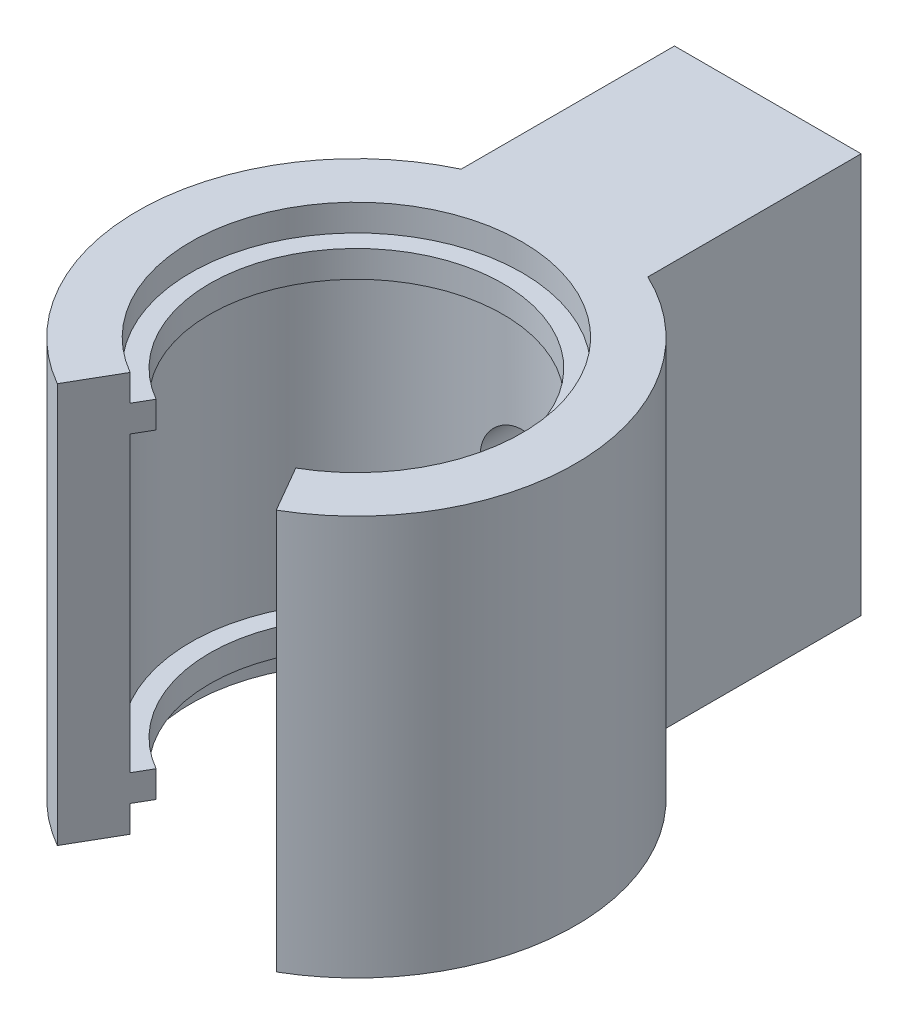
ISO-10303-21;
HEADER;
FILE_DESCRIPTION(('STEP AP214'),'2;1');
FILE_NAME('part.step','',(''),(''),'','','');
FILE_SCHEMA(('AUTOMOTIVE_DESIGN { 1 0 10303 214 1 1 1 1 }'));
ENDSEC;
DATA;
#1=APPLICATION_CONTEXT('core data for automotive mechanical design processes');
#2=APPLICATION_PROTOCOL_DEFINITION('international standard','automotive_design',2000,#1);
#3=PRODUCT_CONTEXT('',#1,'mechanical');
#4=PRODUCT('Part','Part','',(#3));
#5=PRODUCT_RELATED_PRODUCT_CATEGORY('part','',(#4));
#6=PRODUCT_DEFINITION_FORMATION('','',#4);
#7=PRODUCT_DEFINITION_CONTEXT('part definition',#1,'design');
#8=PRODUCT_DEFINITION('design','',#6,#7);
#9=PRODUCT_DEFINITION_SHAPE('','',#8);
#10=(LENGTH_UNIT() NAMED_UNIT(*) SI_UNIT(.MILLI.,.METRE.));
#11=(NAMED_UNIT(*) PLANE_ANGLE_UNIT() SI_UNIT($,.RADIAN.));
#12=(NAMED_UNIT(*) SI_UNIT($,.STERADIAN.) SOLID_ANGLE_UNIT());
#13=UNCERTAINTY_MEASURE_WITH_UNIT(LENGTH_MEASURE(1.E-05),#10,'distance_accuracy_value','');
#14=(GEOMETRIC_REPRESENTATION_CONTEXT(3) GLOBAL_UNCERTAINTY_ASSIGNED_CONTEXT((#13)) GLOBAL_UNIT_ASSIGNED_CONTEXT((#10,
#11,#12)) REPRESENTATION_CONTEXT('',''));
#15=CARTESIAN_POINT('',(0.,0.,0.));
#16=DIRECTION('',(0.,0.,1.));
#17=DIRECTION('',(1.,0.,0.));
#18=AXIS2_PLACEMENT_3D('',#15,#16,#17);
#19=CARTESIAN_POINT('',(0.,15.,0.));
#20=DIRECTION('',(0.,-1.,0.));
#21=DIRECTION('',(0.,0.,-1.));
#22=AXIS2_PLACEMENT_3D('',#19,#20,#21);
#23=CYLINDRICAL_SURFACE('',#22,6.21127915577534);
#24=DIRECTION('',(0.,1.,0.));
#25=VECTOR('',#24,1.);
#26=CARTESIAN_POINT('',(-3.10563957788768,0.,5.37912553889821));
#27=LINE('',#26,#25);
#28=CARTESIAN_POINT('',(-3.10563957788768,14.,5.37912553889821));
#29=VERTEX_POINT('',#28);
#30=CARTESIAN_POINT('',(-3.10563957788768,15.,5.37912553889821));
#31=VERTEX_POINT('',#30);
#32=EDGE_CURVE('E62',#29,#31,#27,.T.);
#33=ORIENTED_EDGE('',*,*,#32,.F.);
#34=CARTESIAN_POINT('',(0.,14.,0.));
#35=DIRECTION('',(0.,-1.,0.));
#36=DIRECTION('',(0.,0.,1.));
#37=AXIS2_PLACEMENT_3D('',#34,#35,#36);
#38=CIRCLE('',#37,6.21127915577534);
#39=CARTESIAN_POINT('',(3.10563957788768,14.,5.37912553889821));
#40=VERTEX_POINT('',#39);
#41=EDGE_CURVE('E195',#29,#40,#38,.T.);
#42=ORIENTED_EDGE('',*,*,#41,.T.);
#43=DIRECTION('',(0.,1.,0.));
#44=VECTOR('',#43,1.);
#45=CARTESIAN_POINT('',(3.10563957788768,0.,5.37912553889821));
#46=LINE('',#45,#44);
#47=CARTESIAN_POINT('',(3.10563957788768,15.,5.37912553889821));
#48=VERTEX_POINT('',#47);
#49=EDGE_CURVE('E255',#40,#48,#46,.T.);
#50=ORIENTED_EDGE('',*,*,#49,.T.);
#51=CARTESIAN_POINT('',(0.,15.,0.));
#52=DIRECTION('',(0.,1.,0.));
#53=DIRECTION('',(0.,0.,1.));
#54=AXIS2_PLACEMENT_3D('',#51,#52,#53);
#55=CIRCLE('',#54,6.21127915577534);
#56=EDGE_CURVE('E273',#48,#31,#55,.T.);
#57=ORIENTED_EDGE('',*,*,#56,.T.);
#58=EDGE_LOOP('',(#33,#42,#50,#57));
#59=FACE_BOUND('',#58,.T.);
#60=ADVANCED_FACE('F39',(#59),#23,.F.);
#61=CARTESIAN_POINT('',(3.10563957788768,0.,5.37912553889821));
#62=VERTEX_POINT('',#61);
#63=CARTESIAN_POINT('',(3.10563957788768,1.,5.37912553889821));
#64=VERTEX_POINT('',#63);
#65=EDGE_CURVE('E257',#62,#64,#46,.T.);
#66=ORIENTED_EDGE('',*,*,#65,.T.);
#67=CARTESIAN_POINT('',(0.,1.,0.));
#68=DIRECTION('',(0.,-1.,0.));
#69=DIRECTION('',(0.,0.,1.));
#70=AXIS2_PLACEMENT_3D('',#67,#68,#69);
#71=CIRCLE('',#70,6.21127915577534);
#72=CARTESIAN_POINT('',(-3.10563957788768,1.,5.37912553889821));
#73=VERTEX_POINT('',#72);
#74=EDGE_CURVE('E206',#73,#64,#71,.T.);
#75=ORIENTED_EDGE('',*,*,#74,.F.);
#76=CARTESIAN_POINT('',(-3.10563957788768,0.,5.37912553889821));
#77=VERTEX_POINT('',#76);
#78=EDGE_CURVE('E262',#77,#73,#27,.T.);
#79=ORIENTED_EDGE('',*,*,#78,.F.);
#80=CARTESIAN_POINT('',(0.,0.,0.));
#81=DIRECTION('',(0.,1.,0.));
#82=DIRECTION('',(0.,0.,1.));
#83=AXIS2_PLACEMENT_3D('',#80,#81,#82);
#84=CIRCLE('',#83,6.21127915577534);
#85=EDGE_CURVE('E269',#62,#77,#84,.T.);
#86=ORIENTED_EDGE('',*,*,#85,.F.);
#87=EDGE_LOOP('',(#66,#75,#79,#86));
#88=FACE_BOUND('',#87,.T.);
#89=ADVANCED_FACE('F357',(#88),#23,.F.);
#90=CARTESIAN_POINT('',(0.,15.,0.));
#91=DIRECTION('',(0.,-1.,0.));
#92=DIRECTION('',(0.,0.,-1.));
#93=AXIS2_PLACEMENT_3D('',#90,#91,#92);
#94=CYLINDRICAL_SURFACE('',#93,8.21127915577534);
#95=CARTESIAN_POINT('',(0.,15.,0.));
#96=DIRECTION('',(0.,1.,0.));
#97=DIRECTION('',(0.,0.,1.));
#98=AXIS2_PLACEMENT_3D('',#95,#96,#97);
#99=CIRCLE('',#98,8.21127915577534);
#100=CARTESIAN_POINT('',(4.10563957788768,15.,7.11117634646708));
#101=VERTEX_POINT('',#100);
#102=CARTESIAN_POINT('',(3.5,15.,-7.42799470746113));
#103=VERTEX_POINT('',#102);
#104=EDGE_CURVE('E280',#101,#103,#99,.T.);
#105=ORIENTED_EDGE('',*,*,#104,.F.);
#106=DIRECTION('',(0.,1.,0.));
#107=VECTOR('',#106,1.);
#108=CARTESIAN_POINT('',(4.10563957788768,0.,7.11117634646708));
#109=LINE('',#108,#107);
#110=CARTESIAN_POINT('',(4.10563957788768,0.,7.11117634646708));
#111=VERTEX_POINT('',#110);
#112=EDGE_CURVE('E252',#111,#101,#109,.T.);
#113=ORIENTED_EDGE('',*,*,#112,.F.);
#114=CARTESIAN_POINT('',(0.,0.,0.));
#115=DIRECTION('',(0.,1.,0.));
#116=DIRECTION('',(0.,0.,1.));
#117=AXIS2_PLACEMENT_3D('',#114,#115,#116);
#118=CIRCLE('',#117,8.21127915577534);
#119=CARTESIAN_POINT('',(3.5,0.,-7.42799470746113));
#120=VERTEX_POINT('',#119);
#121=EDGE_CURVE('E295',#111,#120,#118,.T.);
#122=ORIENTED_EDGE('',*,*,#121,.T.);
#123=DIRECTION('',(0.,-1.,0.));
#124=VECTOR('',#123,1.);
#125=CARTESIAN_POINT('',(3.5,15.,-7.42799470746113));
#126=LINE('',#125,#124);
#127=EDGE_CURVE('E11',#103,#120,#126,.T.);
#128=ORIENTED_EDGE('',*,*,#127,.F.);
#129=EDGE_LOOP('',(#105,#113,#122,#128));
#130=FACE_BOUND('',#129,.T.);
#131=ADVANCED_FACE('F377',(#130),#94,.T.);
#132=CARTESIAN_POINT('',(0.,15.,0.));
#133=DIRECTION('',(0.,1.,0.));
#134=DIRECTION('',(0.,0.,1.));
#135=AXIS2_PLACEMENT_3D('',#132,#133,#134);
#136=PLANE('',#135);
#137=DIRECTION('',(-0.500000000000001,0.,-0.866025403784438));
#138=VECTOR('',#137,1.);
#139=CARTESIAN_POINT('',(3.10563957788768,15.,5.37912553889821));
#140=LINE('',#139,#138);
#141=EDGE_CURVE('E274',#101,#48,#140,.T.);
#142=ORIENTED_EDGE('',*,*,#141,.F.);
#143=ORIENTED_EDGE('',*,*,#104,.T.);
#144=DIRECTION('',(0.,0.,-1.));
#145=VECTOR('',#144,1.);
#146=CARTESIAN_POINT('',(3.5,15.,-7.42799470746113));
#147=LINE('',#146,#145);
#148=CARTESIAN_POINT('',(3.5,15.,-15.4279947074611));
#149=VERTEX_POINT('',#148);
#150=EDGE_CURVE('E279',#103,#149,#147,.T.);
#151=ORIENTED_EDGE('',*,*,#150,.T.);
#152=DIRECTION('',(-1.,0.,0.));
#153=VECTOR('',#152,1.);
#154=CARTESIAN_POINT('',(-3.5,15.,-15.4279947074611));
#155=LINE('',#154,#153);
#156=CARTESIAN_POINT('',(-3.5,15.,-15.4279947074611));
#157=VERTEX_POINT('',#156);
#158=EDGE_CURVE('E283',#149,#157,#155,.T.);
#159=ORIENTED_EDGE('',*,*,#158,.T.);
#160=DIRECTION('',(0.,0.,1.));
#161=VECTOR('',#160,1.);
#162=CARTESIAN_POINT('',(-3.5,15.,-7.42799470746113));
#163=LINE('',#162,#161);
#164=CARTESIAN_POINT('',(-3.5,15.,-7.42799470746113));
#165=VERTEX_POINT('',#164);
#166=EDGE_CURVE('E286',#157,#165,#163,.T.);
#167=ORIENTED_EDGE('',*,*,#166,.T.);
#168=CARTESIAN_POINT('',(-4.10563957788768,15.,7.11117634646708));
#169=VERTEX_POINT('',#168);
#170=EDGE_CURVE('E275',#165,#169,#99,.T.);
#171=ORIENTED_EDGE('',*,*,#170,.T.);
#172=DIRECTION('',(-0.500000000000001,0.,0.866025403784438));
#173=VECTOR('',#172,1.);
#174=CARTESIAN_POINT('',(-3.10563957788768,15.,5.37912553889821));
#175=LINE('',#174,#173);
#176=EDGE_CURVE('E260',#31,#169,#175,.T.);
#177=ORIENTED_EDGE('',*,*,#176,.F.);
#178=ORIENTED_EDGE('',*,*,#56,.F.);
#179=EDGE_LOOP('',(#142,#143,#151,#159,#167,#171,#177,#178));
#180=FACE_BOUND('',#179,.T.);
#181=ADVANCED_FACE('F327',(#180),#136,.T.);
#182=CARTESIAN_POINT('',(0.,0.,0.));
#183=DIRECTION('',(0.,1.,0.));
#184=DIRECTION('',(0.,0.,1.));
#185=AXIS2_PLACEMENT_3D('',#182,#183,#184);
#186=PLANE('',#185);
#187=ORIENTED_EDGE('',*,*,#121,.F.);
#188=DIRECTION('',(-0.500000000000001,0.,-0.866025403784438));
#189=VECTOR('',#188,1.);
#190=CARTESIAN_POINT('',(3.10563957788768,0.,5.37912553889821));
#191=LINE('',#190,#189);
#192=EDGE_CURVE('E248',#111,#62,#191,.T.);
#193=ORIENTED_EDGE('',*,*,#192,.T.);
#194=ORIENTED_EDGE('',*,*,#85,.T.);
#195=DIRECTION('',(-0.500000000000001,0.,0.866025403784438));
#196=VECTOR('',#195,1.);
#197=CARTESIAN_POINT('',(-3.10563957788768,0.,5.37912553889821));
#198=LINE('',#197,#196);
#199=CARTESIAN_POINT('',(-4.10563957788768,0.,7.11117634646708));
#200=VERTEX_POINT('',#199);
#201=EDGE_CURVE('E242',#77,#200,#198,.T.);
#202=ORIENTED_EDGE('',*,*,#201,.T.);
#203=CARTESIAN_POINT('',(-3.5,0.,-7.42799470746113));
#204=VERTEX_POINT('',#203);
#205=EDGE_CURVE('E290',#204,#200,#118,.T.);
#206=ORIENTED_EDGE('',*,*,#205,.F.);
#207=DIRECTION('',(0.,0.,1.));
#208=VECTOR('',#207,1.);
#209=CARTESIAN_POINT('',(-3.5,0.,-7.42799470746113));
#210=LINE('',#209,#208);
#211=CARTESIAN_POINT('',(-3.5,0.,-15.4279947074611));
#212=VERTEX_POINT('',#211);
#213=EDGE_CURVE('E301',#212,#204,#210,.T.);
#214=ORIENTED_EDGE('',*,*,#213,.F.);
#215=DIRECTION('',(-1.,0.,0.));
#216=VECTOR('',#215,1.);
#217=CARTESIAN_POINT('',(-3.5,0.,-15.4279947074611));
#218=LINE('',#217,#216);
#219=CARTESIAN_POINT('',(3.5,0.,-15.4279947074611));
#220=VERTEX_POINT('',#219);
#221=EDGE_CURVE('E298',#220,#212,#218,.T.);
#222=ORIENTED_EDGE('',*,*,#221,.F.);
#223=DIRECTION('',(0.,0.,-1.));
#224=VECTOR('',#223,1.);
#225=CARTESIAN_POINT('',(3.5,0.,-7.42799470746113));
#226=LINE('',#225,#224);
#227=EDGE_CURVE('E294',#120,#220,#226,.T.);
#228=ORIENTED_EDGE('',*,*,#227,.F.);
#229=EDGE_LOOP('',(#187,#193,#194,#202,#206,#214,#222,#228));
#230=FACE_BOUND('',#229,.T.);
#231=ADVANCED_FACE('F351',(#230),#186,.F.);
#232=ORIENTED_EDGE('',*,*,#205,.T.);
#233=DIRECTION('',(0.,1.,0.));
#234=VECTOR('',#233,1.);
#235=CARTESIAN_POINT('',(-4.10563957788768,0.,7.11117634646708));
#236=LINE('',#235,#234);
#237=EDGE_CURVE('E256',#200,#169,#236,.T.);
#238=ORIENTED_EDGE('',*,*,#237,.T.);
#239=ORIENTED_EDGE('',*,*,#170,.F.);
#240=DIRECTION('',(0.,-1.,0.));
#241=VECTOR('',#240,1.);
#242=CARTESIAN_POINT('',(-3.5,15.,-7.42799470746113));
#243=LINE('',#242,#241);
#244=EDGE_CURVE('E289',#165,#204,#243,.T.);
#245=ORIENTED_EDGE('',*,*,#244,.T.);
#246=EDGE_LOOP('',(#232,#238,#239,#245));
#247=FACE_BOUND('',#246,.T.);
#248=ADVANCED_FACE('F41',(#247),#94,.T.);
#249=CARTESIAN_POINT('',(3.5,15.,-7.42799470746113));
#250=DIRECTION('',(-1.,0.,0.));
#251=DIRECTION('',(0.,0.,1.));
#252=AXIS2_PLACEMENT_3D('',#249,#250,#251);
#253=PLANE('',#252);
#254=ORIENTED_EDGE('',*,*,#227,.T.);
#255=DIRECTION('',(0.,-1.,0.));
#256=VECTOR('',#255,1.);
#257=CARTESIAN_POINT('',(3.5,15.,-15.4279947074611));
#258=LINE('',#257,#256);
#259=EDGE_CURVE('E54',#149,#220,#258,.T.);
#260=ORIENTED_EDGE('',*,*,#259,.F.);
#261=ORIENTED_EDGE('',*,*,#150,.F.);
#262=ORIENTED_EDGE('',*,*,#127,.T.);
#263=EDGE_LOOP('',(#254,#260,#261,#262));
#264=FACE_BOUND('',#263,.T.);
#265=ADVANCED_FACE('F376',(#264),#253,.F.);
#266=CARTESIAN_POINT('',(-3.5,15.,-15.4279947074611));
#267=DIRECTION('',(0.,0.,1.));
#268=DIRECTION('',(1.,0.,0.));
#269=AXIS2_PLACEMENT_3D('',#266,#267,#268);
#270=PLANE('',#269);
#271=CARTESIAN_POINT('',(0.,7.5,-15.4279947074611));
#272=DIRECTION('',(0.,0.,-1.));
#273=DIRECTION('',(-1.,0.,0.));
#274=AXIS2_PLACEMENT_3D('',#271,#272,#273);
#275=CIRCLE('',#274,1.4);
#276=CARTESIAN_POINT('',(-1.4,7.5,-15.4279947074611));
#277=VERTEX_POINT('',#276);
#278=EDGE_CURVE('E402',#277,#277,#275,.T.);
#279=ORIENTED_EDGE('',*,*,#278,.F.);
#280=EDGE_LOOP('',(#279));
#281=FACE_BOUND('',#280,.T.);
#282=ORIENTED_EDGE('',*,*,#221,.T.);
#283=DIRECTION('',(0.,-1.,0.));
#284=VECTOR('',#283,1.);
#285=CARTESIAN_POINT('',(-3.5,15.,-15.4279947074611));
#286=LINE('',#285,#284);
#287=EDGE_CURVE('E307',#157,#212,#286,.T.);
#288=ORIENTED_EDGE('',*,*,#287,.F.);
#289=ORIENTED_EDGE('',*,*,#158,.F.);
#290=ORIENTED_EDGE('',*,*,#259,.T.);
#291=EDGE_LOOP('',(#282,#288,#289,#290));
#292=FACE_BOUND('',#291,.T.);
#293=ADVANCED_FACE('F396',(#281,#292),#270,.F.);
#294=CARTESIAN_POINT('',(-3.5,15.,-7.42799470746113));
#295=DIRECTION('',(1.,0.,0.));
#296=DIRECTION('',(0.,0.,-1.));
#297=AXIS2_PLACEMENT_3D('',#294,#295,#296);
#298=PLANE('',#297);
#299=ORIENTED_EDGE('',*,*,#213,.T.);
#300=ORIENTED_EDGE('',*,*,#244,.F.);
#301=ORIENTED_EDGE('',*,*,#166,.F.);
#302=ORIENTED_EDGE('',*,*,#287,.T.);
#303=EDGE_LOOP('',(#299,#300,#301,#302));
#304=FACE_BOUND('',#303,.T.);
#305=ADVANCED_FACE('F347',(#304),#298,.F.);
#306=CARTESIAN_POINT('',(-1.4,7.5,-6.05144517871304));
#307=CARTESIAN_POINT('',(-1.39999741655848,7.42244074967617,-6.05144674295134));
#308=CARTESIAN_POINT('',(-1.39353295951935,7.34485097724104,-6.05295250314705));
#309=CARTESIAN_POINT('',(-1.36787681919197,7.19188231366613,-6.05880092190033));
#310=CARTESIAN_POINT('',(-1.34867630172473,7.11650499508616,-6.06314554956488));
#311=CARTESIAN_POINT('',(-1.29818694064797,6.97019604780264,-6.07415522084465));
#312=CARTESIAN_POINT('',(-1.26691183156465,6.89925947402908,-6.08081762719978));
#313=CARTESIAN_POINT('',(-1.19320094136914,6.76363725979286,-6.09570897726698));
#314=CARTESIAN_POINT('',(-1.15076524470228,6.69895157203864,-6.10393790912599));
#315=CARTESIAN_POINT('',(-1.05512656023878,6.5765070767414,-6.12119999393773));
#316=CARTESIAN_POINT('',(-1.00176108461976,6.51887668777774,-6.13024396952495));
#317=CARTESIAN_POINT('',(-0.886128315498982,6.41330474836805,-6.14802254565793));
#318=CARTESIAN_POINT('',(-0.823860303799267,6.36536398037069,-6.15675712117233));
#319=CARTESIAN_POINT('',(-0.691325167243824,6.28002061007935,-6.17305100334222));
#320=CARTESIAN_POINT('',(-0.620976254492197,6.24274206427739,-6.18059604950956));
#321=CARTESIAN_POINT('',(-0.474813545368164,6.18058474825768,-6.19353825239675));
#322=CARTESIAN_POINT('',(-0.399000402165996,6.15570449880625,-6.19893566533401));
#323=CARTESIAN_POINT('',(-0.24539733545118,6.11945545030858,-6.20689797414003));
#324=CARTESIAN_POINT('',(-0.167661141671802,6.10786914913317,-6.20950841671539));
#325=CARTESIAN_POINT('',(-0.0113074882683587,6.09785630639812,-6.21176065025935));
#326=CARTESIAN_POINT('',(0.0673098634049297,6.09942817005378,-6.21140280098838));
#327=CARTESIAN_POINT('',(0.221692943819922,6.11552617091206,-6.20779339705777));
#328=CARTESIAN_POINT('',(0.297484530786542,6.12981780444421,-6.2045942276571));
#329=CARTESIAN_POINT('',(0.445565052039461,6.17057531351617,-6.19572158777144));
#330=CARTESIAN_POINT('',(0.51785382149793,6.19704176133772,-6.19004800097617));
#331=CARTESIAN_POINT('',(0.657520921735607,6.26160140202038,-6.17678059744856));
#332=CARTESIAN_POINT('',(0.724857252400683,6.29978237228744,-6.16917236063072));
#333=CARTESIAN_POINT('',(0.852251907256294,6.38662157415156,-6.15286812402321));
#334=CARTESIAN_POINT('',(0.912309181058971,6.43528131505746,-6.14417196761083));
#335=CARTESIAN_POINT('',(1.0248365664793,6.54296963823549,-6.1264198333266));
#336=CARTESIAN_POINT('',(1.0771098932032,6.60220342623982,-6.11736015015751));
#337=CARTESIAN_POINT('',(1.17101938096968,6.72869059551659,-6.10008106203917));
#338=CARTESIAN_POINT('',(1.2126552163571,6.7959442222152,-6.09186168281952));
#339=CARTESIAN_POINT('',(1.28420289337599,6.93689373646631,-6.07718325265418));
#340=CARTESIAN_POINT('',(1.31407550513569,7.01061019471472,-6.07073011349999));
#341=CARTESIAN_POINT('',(1.36094829955712,7.16219717647347,-6.06039525321015));
#342=CARTESIAN_POINT('',(1.37795066487194,7.24006699322075,-6.05651309607804));
#343=CARTESIAN_POINT('',(1.39829083685189,7.39594667625268,-6.0518492264115));
#344=CARTESIAN_POINT('',(1.40191607268794,7.47391713031893,-6.0510023085079));
#345=CARTESIAN_POINT('',(1.39617903701098,7.62934833922898,-6.05232858775846));
#346=CARTESIAN_POINT('',(1.3868177176649,7.70680913102257,-6.05450156349573));
#347=CARTESIAN_POINT('',(1.3556232495431,7.8580080740866,-6.0615610275097));
#348=CARTESIAN_POINT('',(1.33395022198825,7.93178103947383,-6.06641265596834));
#349=CARTESIAN_POINT('',(1.27892176011211,8.07464829508665,-6.07825098760357));
#350=CARTESIAN_POINT('',(1.24556515127348,8.14374211409726,-6.08523790542574));
#351=CARTESIAN_POINT('',(1.16748962187505,8.27652835767623,-6.10070161053213));
#352=CARTESIAN_POINT('',(1.12259469518377,8.34011463293559,-6.10920078493257));
#353=CARTESIAN_POINT('',(1.02294563750656,8.45895642769333,-6.12667317996916));
#354=CARTESIAN_POINT('',(0.968190202470265,8.51421084352688,-6.13564646319508));
#355=CARTESIAN_POINT('',(0.849069961693782,8.61594591756109,-6.15327218844914));
#356=CARTESIAN_POINT('',(0.784535560653021,8.66223001910955,-6.16191468743425));
#357=CARTESIAN_POINT('',(0.648441162250651,8.74330063164673,-6.17771791316331));
#358=CARTESIAN_POINT('',(0.576881503468196,8.77808769637753,-6.18487871126554));
#359=CARTESIAN_POINT('',(0.429226909254133,8.83490793197618,-6.19687000117714));
#360=CARTESIAN_POINT('',(0.35316540294957,8.85702461297993,-6.20171571560813));
#361=CARTESIAN_POINT('',(0.198284321042645,8.88813534639949,-6.20859685935039));
#362=CARTESIAN_POINT('',(0.119465174561126,8.89713143131404,-6.21063272393013));
#363=CARTESIAN_POINT('',(-0.036831969037835,8.90164950686265,-6.21165087001155));
#364=CARTESIAN_POINT('',(-0.114301214969824,8.89746423631772,-6.21069949520856));
#365=CARTESIAN_POINT('',(-0.26740189189339,8.87639638350823,-6.20599321026953));
#366=CARTESIAN_POINT('',(-0.343033359950535,8.85951405754639,-6.20223835672451));
#367=CARTESIAN_POINT('',(-0.490068775119286,8.81367521764367,-6.19235303912508));
#368=CARTESIAN_POINT('',(-0.561487016706953,8.78476257369692,-6.18623121220489));
#369=CARTESIAN_POINT('',(-0.69849642287564,8.71572572507948,-6.17226370985493));
#370=CARTESIAN_POINT('',(-0.764086983872279,8.67560036086508,-6.1644178561559));
#371=CARTESIAN_POINT('',(-0.888999316281081,8.58433504398396,-6.14766005327489));
#372=CARTESIAN_POINT('',(-0.948169282049802,8.53299064485752,-6.138729904151));
#373=CARTESIAN_POINT('',(-1.05715325602981,8.42115405773719,-6.12090453272239));
#374=CARTESIAN_POINT('',(-1.10696498621931,8.36065964886102,-6.11200931943652));
#375=CARTESIAN_POINT('',(-1.1965123896917,8.23119249727105,-6.09511759780477));
#376=CARTESIAN_POINT('',(-1.23609268893071,8.16211024001219,-6.08713587029127));
#377=CARTESIAN_POINT('',(-1.30301854810748,8.01810759586773,-6.07316302221681));
#378=CARTESIAN_POINT('',(-1.33037417574262,7.94319207293595,-6.06717026467897));
#379=CARTESIAN_POINT('',(-1.36735187726523,7.80686567289764,-6.05892782834633));
#380=CARTESIAN_POINT('',(-1.37957082234304,7.74617833288489,-6.0561409430718));
#381=CARTESIAN_POINT('',(-1.39589569054642,7.62366708871455,-6.05239904500231));
#382=CARTESIAN_POINT('',(-1.40000205995303,7.5618432472659,-6.05144393143982));
#383=CARTESIAN_POINT('',(-1.4,7.5,-6.05144517871304));
#384=B_SPLINE_CURVE_WITH_KNOTS('',3,(#306,#307,#308,#309,#310,#311,#312,#313,#314,#315,#316,
#317,#318,#319,#320,#321,#322,#323,#324,#325,#326,#327,#328,#329,#330,#331,#332,#333,#334,#335,
#336,#337,#338,#339,#340,#341,#342,#343,#344,#345,#346,#347,#348,#349,#350,#351,#352,#353,#354,
#355,#356,#357,#358,#359,#360,#361,#362,#363,#364,#365,#366,#367,#368,#369,#370,#371,#372,#373,
#374,#375,#376,#377,#378,#379,#380,#381,#382,#383),.UNSPECIFIED.,.T.,.F.,(4,2,2,2,2,2,2,2,2,2,2,
2,2,2,2,2,2,2,2,2,2,2,2,2,2,2,2,2,2,2,2,2,2,2,2,2,2,2,4),(0.,0.232451012871686,
0.465063430774375,0.697412034111021,0.929758879458818,1.1658498258538,1.40195982926941,
1.64071457675884,1.87944083173079,2.11420295015271,2.34893661554805,2.57943032693494,
2.80993487387284,3.04221062141009,3.27451984716843,3.5119580260655,3.749403473002,
3.98763421702687,4.22582455066486,4.45886615374066,4.69189067124006,4.92195176032677,
5.15203598344373,5.38586303308209,5.61972102904384,5.85823445235322,6.09673638625269,
6.33364771986117,6.57052234986657,6.80217373196504,7.03382043807473,7.26462971888123,
7.49546287726161,7.73091772426696,7.96642981264639,8.2053322492783,8.4440375722244,
8.62939671744603,8.81474566558842),.UNSPECIFIED.);
#385=CARTESIAN_POINT('',(-1.4,7.5,-6.05144517871304));
#386=VERTEX_POINT('',#385);
#387=EDGE_CURVE('E43',#386,#386,#384,.T.);
#388=ORIENTED_EDGE('',*,*,#387,.F.);
#389=EDGE_LOOP('',(#388));
#390=FACE_BOUND('',#389,.T.);
#391=CARTESIAN_POINT('',(0.,13.,0.));
#392=DIRECTION('',(0.,-1.,0.));
#393=DIRECTION('',(0.,0.,1.));
#394=AXIS2_PLACEMENT_3D('',#391,#392,#393);
#395=CIRCLE('',#394,6.21127915577534);
#396=CARTESIAN_POINT('',(-3.10563957788768,13.,5.37912553889821));
#397=VERTEX_POINT('',#396);
#398=CARTESIAN_POINT('',(3.10563957788768,13.,5.37912553889821));
#399=VERTEX_POINT('',#398);
#400=EDGE_CURVE('E70',#397,#399,#395,.T.);
#401=ORIENTED_EDGE('',*,*,#400,.F.);
#402=CARTESIAN_POINT('',(-3.10563957788768,2.,5.37912553889821));
#403=VERTEX_POINT('',#402);
#404=EDGE_CURVE('E185',#403,#397,#27,.T.);
#405=ORIENTED_EDGE('',*,*,#404,.F.);
#406=CARTESIAN_POINT('',(0.,2.,0.));
#407=DIRECTION('',(0.,-1.,0.));
#408=DIRECTION('',(0.,0.,1.));
#409=AXIS2_PLACEMENT_3D('',#406,#407,#408);
#410=CIRCLE('',#409,6.21127915577534);
#411=CARTESIAN_POINT('',(3.10563957788768,2.,5.37912553889821));
#412=VERTEX_POINT('',#411);
#413=EDGE_CURVE('E208',#403,#412,#410,.T.);
#414=ORIENTED_EDGE('',*,*,#413,.T.);
#415=EDGE_CURVE('E261',#412,#399,#46,.T.);
#416=ORIENTED_EDGE('',*,*,#415,.T.);
#417=EDGE_LOOP('',(#401,#405,#414,#416));
#418=FACE_BOUND('',#417,.T.);
#419=ADVANCED_FACE('F332',(#390,#418),#23,.F.);
#420=CARTESIAN_POINT('',(-3.10563957788768,0.,5.37912553889821));
#421=DIRECTION('',(-0.866025403784438,0.,-0.500000000000001));
#422=DIRECTION('',(-0.500000000000001,0.,0.866025403784438));
#423=AXIS2_PLACEMENT_3D('',#420,#421,#422);
#424=PLANE('',#423);
#425=ORIENTED_EDGE('',*,*,#176,.T.);
#426=ORIENTED_EDGE('',*,*,#237,.F.);
#427=ORIENTED_EDGE('',*,*,#201,.F.);
#428=ORIENTED_EDGE('',*,*,#78,.T.);
#429=DIRECTION('',(-0.500000000000003,0.,0.866025403784437));
#430=VECTOR('',#429,1.);
#431=CARTESIAN_POINT('',(-3.10563957788768,1.,5.37912553889821));
#432=LINE('',#431,#430);
#433=CARTESIAN_POINT('',(-2.74999999245474,1.,4.76313970774563));
#434=VERTEX_POINT('',#433);
#435=EDGE_CURVE('E213',#434,#73,#432,.T.);
#436=ORIENTED_EDGE('',*,*,#435,.F.);
#437=DIRECTION('',(0.,-1.,0.));
#438=VECTOR('',#437,1.);
#439=CARTESIAN_POINT('',(-2.74999999245474,2.,4.76313970774563));
#440=LINE('',#439,#438);
#441=CARTESIAN_POINT('',(-2.74999999245474,2.,4.76313970774563));
#442=VERTEX_POINT('',#441);
#443=EDGE_CURVE('E239',#442,#434,#440,.T.);
#444=ORIENTED_EDGE('',*,*,#443,.F.);
#445=DIRECTION('',(-0.500000000000003,0.,0.866025403784437));
#446=VECTOR('',#445,1.);
#447=CARTESIAN_POINT('',(-3.10563957788768,2.,5.37912553889821));
#448=LINE('',#447,#446);
#449=EDGE_CURVE('E221',#442,#403,#448,.T.);
#450=ORIENTED_EDGE('',*,*,#449,.T.);
#451=ORIENTED_EDGE('',*,*,#404,.T.);
#452=DIRECTION('',(-0.500000000000003,0.,0.866025403784437));
#453=VECTOR('',#452,1.);
#454=CARTESIAN_POINT('',(-3.10563957788768,13.,5.37912553889821));
#455=LINE('',#454,#453);
#456=CARTESIAN_POINT('',(-2.74999999245474,13.,4.76313970774563));
#457=VERTEX_POINT('',#456);
#458=EDGE_CURVE('E165',#457,#397,#455,.T.);
#459=ORIENTED_EDGE('',*,*,#458,.F.);
#460=DIRECTION('',(0.,1.,0.));
#461=VECTOR('',#460,1.);
#462=CARTESIAN_POINT('',(-2.74999999245474,13.,4.76313970774563));
#463=LINE('',#462,#461);
#464=CARTESIAN_POINT('',(-2.74999999245474,14.,4.76313970774563));
#465=VERTEX_POINT('',#464);
#466=EDGE_CURVE('E174',#457,#465,#463,.T.);
#467=ORIENTED_EDGE('',*,*,#466,.T.);
#468=DIRECTION('',(-0.500000000000003,0.,0.866025403784437));
#469=VECTOR('',#468,1.);
#470=CARTESIAN_POINT('',(-3.10563957788768,14.,5.37912553889821));
#471=LINE('',#470,#469);
#472=EDGE_CURVE('E198',#465,#29,#471,.T.);
#473=ORIENTED_EDGE('',*,*,#472,.T.);
#474=ORIENTED_EDGE('',*,*,#32,.T.);
#475=EDGE_LOOP('',(#425,#426,#427,#428,#436,#444,#450,#451,#459,#467,#473,#474));
#476=FACE_BOUND('',#475,.T.);
#477=ADVANCED_FACE('F183',(#476),#424,.F.);
#478=CARTESIAN_POINT('',(3.10563957788768,0.,5.37912553889821));
#479=DIRECTION('',(0.866025403784438,0.,-0.500000000000001));
#480=DIRECTION('',(-0.500000000000001,0.,-0.866025403784438));
#481=AXIS2_PLACEMENT_3D('',#478,#479,#480);
#482=PLANE('',#481);
#483=ORIENTED_EDGE('',*,*,#141,.T.);
#484=ORIENTED_EDGE('',*,*,#49,.F.);
#485=DIRECTION('',(-0.499999999999996,0.,-0.866025403784441));
#486=VECTOR('',#485,1.);
#487=CARTESIAN_POINT('',(2.74999999245475,14.,4.76313970774563));
#488=LINE('',#487,#486);
#489=CARTESIAN_POINT('',(2.74999999245474,14.,4.76313970774563));
#490=VERTEX_POINT('',#489);
#491=EDGE_CURVE('E189',#40,#490,#488,.T.);
#492=ORIENTED_EDGE('',*,*,#491,.T.);
#493=DIRECTION('',(0.,1.,0.));
#494=VECTOR('',#493,1.);
#495=CARTESIAN_POINT('',(2.74999999245474,13.,4.76313970774563));
#496=LINE('',#495,#494);
#497=CARTESIAN_POINT('',(2.74999999245474,13.,4.76313970774563));
#498=VERTEX_POINT('',#497);
#499=EDGE_CURVE('E181',#498,#490,#496,.T.);
#500=ORIENTED_EDGE('',*,*,#499,.F.);
#501=DIRECTION('',(-0.499999999999996,0.,-0.866025403784441));
#502=VECTOR('',#501,1.);
#503=CARTESIAN_POINT('',(2.74999999245475,13.,4.76313970774563));
#504=LINE('',#503,#502);
#505=EDGE_CURVE('E167',#399,#498,#504,.T.);
#506=ORIENTED_EDGE('',*,*,#505,.F.);
#507=ORIENTED_EDGE('',*,*,#415,.F.);
#508=DIRECTION('',(-0.499999999999996,0.,-0.866025403784441));
#509=VECTOR('',#508,1.);
#510=CARTESIAN_POINT('',(2.74999999245475,2.,4.76313970774563));
#511=LINE('',#510,#509);
#512=CARTESIAN_POINT('',(2.74999999245474,2.,4.76313970774563));
#513=VERTEX_POINT('',#512);
#514=EDGE_CURVE('E212',#412,#513,#511,.T.);
#515=ORIENTED_EDGE('',*,*,#514,.T.);
#516=DIRECTION('',(0.,-1.,0.));
#517=VECTOR('',#516,1.);
#518=CARTESIAN_POINT('',(2.74999999245474,2.,4.76313970774563));
#519=LINE('',#518,#517);
#520=CARTESIAN_POINT('',(2.74999999245474,1.,4.76313970774563));
#521=VERTEX_POINT('',#520);
#522=EDGE_CURVE('E224',#513,#521,#519,.T.);
#523=ORIENTED_EDGE('',*,*,#522,.T.);
#524=DIRECTION('',(-0.499999999999996,0.,-0.866025403784441));
#525=VECTOR('',#524,1.);
#526=CARTESIAN_POINT('',(2.74999999245475,1.,4.76313970774563));
#527=LINE('',#526,#525);
#528=EDGE_CURVE('E228',#64,#521,#527,.T.);
#529=ORIENTED_EDGE('',*,*,#528,.F.);
#530=ORIENTED_EDGE('',*,*,#65,.F.);
#531=ORIENTED_EDGE('',*,*,#192,.F.);
#532=ORIENTED_EDGE('',*,*,#112,.T.);
#533=EDGE_LOOP('',(#483,#484,#492,#500,#506,#507,#515,#523,#529,#530,#531,#532));
#534=FACE_BOUND('',#533,.T.);
#535=ADVANCED_FACE('F322',(#534),#482,.F.);
#536=CARTESIAN_POINT('',(0.,2.,0.));
#537=DIRECTION('',(0.,-1.,0.));
#538=DIRECTION('',(0.,0.,-1.));
#539=AXIS2_PLACEMENT_3D('',#536,#537,#538);
#540=CYLINDRICAL_SURFACE('',#539,5.49999998490947);
#541=CARTESIAN_POINT('',(0.,1.,0.));
#542=DIRECTION('',(0.,1.,0.));
#543=DIRECTION('',(0.,0.,-1.));
#544=AXIS2_PLACEMENT_3D('',#541,#542,#543);
#545=CIRCLE('',#544,5.49999998490947);
#546=EDGE_CURVE('E232',#521,#434,#545,.T.);
#547=ORIENTED_EDGE('',*,*,#546,.F.);
#548=ORIENTED_EDGE('',*,*,#522,.F.);
#549=CARTESIAN_POINT('',(0.,2.,0.));
#550=DIRECTION('',(0.,1.,0.));
#551=DIRECTION('',(0.,0.,-1.));
#552=AXIS2_PLACEMENT_3D('',#549,#550,#551);
#553=CIRCLE('',#552,5.49999998490947);
#554=EDGE_CURVE('E217',#513,#442,#553,.T.);
#555=ORIENTED_EDGE('',*,*,#554,.T.);
#556=ORIENTED_EDGE('',*,*,#443,.T.);
#557=EDGE_LOOP('',(#547,#548,#555,#556));
#558=FACE_BOUND('',#557,.T.);
#559=ADVANCED_FACE('F365',(#558),#540,.F.);
#560=CARTESIAN_POINT('',(0.,2.,0.));
#561=DIRECTION('',(0.,1.,0.));
#562=DIRECTION('',(0.,0.,1.));
#563=AXIS2_PLACEMENT_3D('',#560,#561,#562);
#564=PLANE('',#563);
#565=ORIENTED_EDGE('',*,*,#413,.F.);
#566=ORIENTED_EDGE('',*,*,#449,.F.);
#567=ORIENTED_EDGE('',*,*,#554,.F.);
#568=ORIENTED_EDGE('',*,*,#514,.F.);
#569=EDGE_LOOP('',(#565,#566,#567,#568));
#570=FACE_BOUND('',#569,.T.);
#571=ADVANCED_FACE('F367',(#570),#564,.T.);
#572=CARTESIAN_POINT('',(0.,1.,0.));
#573=DIRECTION('',(0.,1.,0.));
#574=DIRECTION('',(0.,0.,1.));
#575=AXIS2_PLACEMENT_3D('',#572,#573,#574);
#576=PLANE('',#575);
#577=ORIENTED_EDGE('',*,*,#74,.T.);
#578=ORIENTED_EDGE('',*,*,#528,.T.);
#579=ORIENTED_EDGE('',*,*,#546,.T.);
#580=ORIENTED_EDGE('',*,*,#435,.T.);
#581=EDGE_LOOP('',(#577,#578,#579,#580));
#582=FACE_BOUND('',#581,.T.);
#583=ADVANCED_FACE('F360',(#582),#576,.F.);
#584=CARTESIAN_POINT('',(0.,13.,0.));
#585=DIRECTION('',(0.,1.,0.));
#586=DIRECTION('',(0.,0.,1.));
#587=AXIS2_PLACEMENT_3D('',#584,#585,#586);
#588=CYLINDRICAL_SURFACE('',#587,5.49999998490947);
#589=CARTESIAN_POINT('',(0.,14.,0.));
#590=DIRECTION('',(0.,1.,0.));
#591=DIRECTION('',(0.,0.,-1.));
#592=AXIS2_PLACEMENT_3D('',#589,#590,#591);
#593=CIRCLE('',#592,5.49999998490947);
#594=EDGE_CURVE('E177',#490,#465,#593,.T.);
#595=ORIENTED_EDGE('',*,*,#594,.T.);
#596=ORIENTED_EDGE('',*,*,#466,.F.);
#597=CARTESIAN_POINT('',(0.,13.,0.));
#598=DIRECTION('',(0.,1.,0.));
#599=DIRECTION('',(0.,0.,-1.));
#600=AXIS2_PLACEMENT_3D('',#597,#598,#599);
#601=CIRCLE('',#600,5.49999998490947);
#602=EDGE_CURVE('E161',#498,#457,#601,.T.);
#603=ORIENTED_EDGE('',*,*,#602,.F.);
#604=ORIENTED_EDGE('',*,*,#499,.T.);
#605=EDGE_LOOP('',(#595,#596,#603,#604));
#606=FACE_BOUND('',#605,.T.);
#607=ADVANCED_FACE('F175',(#606),#588,.F.);
#608=CARTESIAN_POINT('',(0.,13.,0.));
#609=DIRECTION('',(0.,-1.,0.));
#610=DIRECTION('',(0.,0.,1.));
#611=AXIS2_PLACEMENT_3D('',#608,#609,#610);
#612=PLANE('',#611);
#613=ORIENTED_EDGE('',*,*,#400,.T.);
#614=ORIENTED_EDGE('',*,*,#505,.T.);
#615=ORIENTED_EDGE('',*,*,#602,.T.);
#616=ORIENTED_EDGE('',*,*,#458,.T.);
#617=EDGE_LOOP('',(#613,#614,#615,#616));
#618=FACE_BOUND('',#617,.T.);
#619=ADVANCED_FACE('F163',(#618),#612,.T.);
#620=CARTESIAN_POINT('',(0.,14.,0.));
#621=DIRECTION('',(0.,-1.,0.));
#622=DIRECTION('',(0.,0.,1.));
#623=AXIS2_PLACEMENT_3D('',#620,#621,#622);
#624=PLANE('',#623);
#625=ORIENTED_EDGE('',*,*,#41,.F.);
#626=ORIENTED_EDGE('',*,*,#472,.F.);
#627=ORIENTED_EDGE('',*,*,#594,.F.);
#628=ORIENTED_EDGE('',*,*,#491,.F.);
#629=EDGE_LOOP('',(#625,#626,#627,#628));
#630=FACE_BOUND('',#629,.T.);
#631=ADVANCED_FACE('F336',(#630),#624,.F.);
#632=CARTESIAN_POINT('',(0.,7.5,-5.42799470746113));
#633=DIRECTION('',(0.,0.,-1.));
#634=DIRECTION('',(-1.,0.,0.));
#635=AXIS2_PLACEMENT_3D('',#632,#633,#634);
#636=CYLINDRICAL_SURFACE('',#635,1.4);
#637=ORIENTED_EDGE('',*,*,#387,.T.);
#638=EDGE_LOOP('',(#637));
#639=FACE_BOUND('',#638,.T.);
#640=ORIENTED_EDGE('',*,*,#278,.T.);
#641=EDGE_LOOP('',(#640));
#642=FACE_BOUND('',#641,.T.);
#643=ADVANCED_FACE('F407',(#639,#642),#636,.F.);
#644=CLOSED_SHELL('',(#60,#89,#131,#181,#231,#248,#265,#293,#305,#419,#477,#535,#559,#571,#583,
#607,#619,#631,#643));
#645=MANIFOLD_SOLID_BREP('B2',#644);
#646=ADVANCED_BREP_SHAPE_REPRESENTATION('',(#18,#645),#14);
#647=SHAPE_DEFINITION_REPRESENTATION(#9,#646);
ENDSEC;
END-ISO-10303-21;
